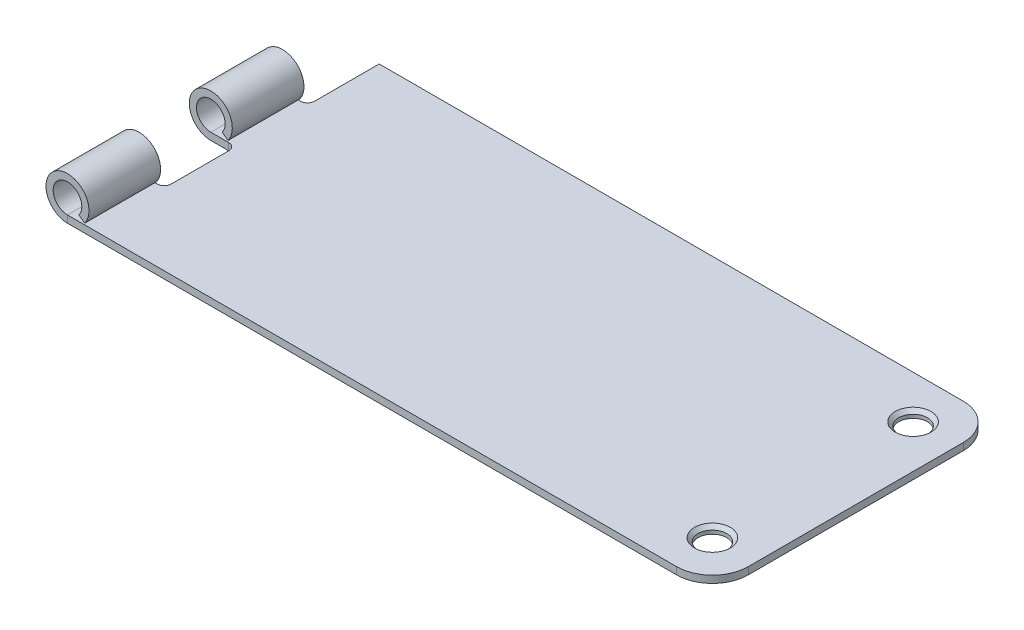
ISO-10303-21;
HEADER;
FILE_DESCRIPTION(('STEP AP214'),'2;1');
FILE_NAME('part.step','',(''),(''),'','','');
FILE_SCHEMA(('AUTOMOTIVE_DESIGN { 1 0 10303 214 1 1 1 1 }'));
ENDSEC;
DATA;
#1=APPLICATION_CONTEXT('core data for automotive mechanical design processes');
#2=APPLICATION_PROTOCOL_DEFINITION('international standard','automotive_design',2000,#1);
#3=PRODUCT_CONTEXT('',#1,'mechanical');
#4=PRODUCT('Part','Part','',(#3));
#5=PRODUCT_RELATED_PRODUCT_CATEGORY('part','',(#4));
#6=PRODUCT_DEFINITION_FORMATION('','',#4);
#7=PRODUCT_DEFINITION_CONTEXT('part definition',#1,'design');
#8=PRODUCT_DEFINITION('design','',#6,#7);
#9=PRODUCT_DEFINITION_SHAPE('','',#8);
#10=(LENGTH_UNIT() NAMED_UNIT(*) SI_UNIT(.MILLI.,.METRE.));
#11=(NAMED_UNIT(*) PLANE_ANGLE_UNIT() SI_UNIT($,.RADIAN.));
#12=(NAMED_UNIT(*) SI_UNIT($,.STERADIAN.) SOLID_ANGLE_UNIT());
#13=UNCERTAINTY_MEASURE_WITH_UNIT(LENGTH_MEASURE(1.E-05),#10,'distance_accuracy_value','');
#14=(GEOMETRIC_REPRESENTATION_CONTEXT(3) GLOBAL_UNCERTAINTY_ASSIGNED_CONTEXT((#13)) GLOBAL_UNIT_ASSIGNED_CONTEXT((#10,
#11,#12)) REPRESENTATION_CONTEXT('',''));
#15=CARTESIAN_POINT('',(0.,0.,0.));
#16=DIRECTION('',(0.,0.,1.));
#17=DIRECTION('',(1.,0.,0.));
#18=AXIS2_PLACEMENT_3D('',#15,#16,#17);
#19=CARTESIAN_POINT('',(-3.,3.,10.));
#20=DIRECTION('',(0.,0.,1.));
#21=DIRECTION('',(-1.,0.,0.));
#22=AXIS2_PLACEMENT_3D('',#19,#20,#21);
#23=PLANE('',#22);
#24=DIRECTION('',(1.,0.,0.));
#25=VECTOR('',#24,1.);
#26=CARTESIAN_POINT('',(-3.,-3.,10.));
#27=LINE('',#26,#25);
#28=CARTESIAN_POINT('',(0.,-3.,10.));
#29=VERTEX_POINT('',#28);
#30=CARTESIAN_POINT('',(2.5,-3.,10.));
#31=VERTEX_POINT('',#30);
#32=EDGE_CURVE('E217',#29,#31,#27,.T.);
#33=ORIENTED_EDGE('',*,*,#32,.F.);
#34=DIRECTION('',(0.,-1.,0.));
#35=VECTOR('',#34,1.);
#36=CARTESIAN_POINT('',(0.,-2.,10.));
#37=LINE('',#36,#35);
#38=CARTESIAN_POINT('',(0.,-2.,10.));
#39=VERTEX_POINT('',#38);
#40=EDGE_CURVE('E206',#39,#29,#37,.T.);
#41=ORIENTED_EDGE('',*,*,#40,.F.);
#42=DIRECTION('',(-1.,0.,0.));
#43=VECTOR('',#42,1.);
#44=CARTESIAN_POINT('',(0.,-2.,10.));
#45=LINE('',#44,#43);
#46=CARTESIAN_POINT('',(2.5,-2.,10.));
#47=VERTEX_POINT('',#46);
#48=EDGE_CURVE('E240',#47,#39,#45,.T.);
#49=ORIENTED_EDGE('',*,*,#48,.F.);
#50=DIRECTION('',(0.,-1.,0.));
#51=VECTOR('',#50,1.);
#52=CARTESIAN_POINT('',(2.5,-2.,10.));
#53=LINE('',#52,#51);
#54=EDGE_CURVE('E304',#31,#47,#53,.F.);
#55=ORIENTED_EDGE('',*,*,#54,.F.);
#56=EDGE_LOOP('',(#33,#41,#49,#55));
#57=FACE_BOUND('',#56,.T.);
#58=ADVANCED_FACE('F39',(#57),#23,.F.);
#59=CARTESIAN_POINT('',(-3.,3.,-10.));
#60=DIRECTION('',(0.,0.,1.));
#61=DIRECTION('',(-1.,0.,0.));
#62=AXIS2_PLACEMENT_3D('',#59,#60,#61);
#63=PLANE('',#62);
#64=DIRECTION('',(1.,0.,0.));
#65=VECTOR('',#64,1.);
#66=CARTESIAN_POINT('',(-3.,-3.,-10.));
#67=LINE('',#66,#65);
#68=CARTESIAN_POINT('',(0.,-3.,-10.));
#69=VERTEX_POINT('',#68);
#70=CARTESIAN_POINT('',(2.5,-3.,-10.));
#71=VERTEX_POINT('',#70);
#72=EDGE_CURVE('E178',#69,#71,#67,.T.);
#73=ORIENTED_EDGE('',*,*,#72,.F.);
#74=DIRECTION('',(0.,-1.,0.));
#75=VECTOR('',#74,1.);
#76=CARTESIAN_POINT('',(0.,-2.,-10.));
#77=LINE('',#76,#75);
#78=CARTESIAN_POINT('',(0.,-2.,-10.));
#79=VERTEX_POINT('',#78);
#80=EDGE_CURVE('E199',#79,#69,#77,.T.);
#81=ORIENTED_EDGE('',*,*,#80,.F.);
#82=DIRECTION('',(-1.,0.,0.));
#83=VECTOR('',#82,1.);
#84=CARTESIAN_POINT('',(0.,-2.,-10.));
#85=LINE('',#84,#83);
#86=CARTESIAN_POINT('',(2.5,-2.,-10.));
#87=VERTEX_POINT('',#86);
#88=EDGE_CURVE('E231',#87,#79,#85,.T.);
#89=ORIENTED_EDGE('',*,*,#88,.F.);
#90=DIRECTION('',(0.,-1.,0.));
#91=VECTOR('',#90,1.);
#92=CARTESIAN_POINT('',(2.5,-2.,-10.));
#93=LINE('',#92,#91);
#94=EDGE_CURVE('E212',#71,#87,#93,.F.);
#95=ORIENTED_EDGE('',*,*,#94,.F.);
#96=EDGE_LOOP('',(#73,#81,#89,#95));
#97=FACE_BOUND('',#96,.T.);
#98=ADVANCED_FACE('F210',(#97),#63,.F.);
#99=CARTESIAN_POINT('',(0.,0.,-20.));
#100=DIRECTION('',(0.,0.,1.));
#101=DIRECTION('',(-1.,0.,0.));
#102=AXIS2_PLACEMENT_3D('',#99,#100,#101);
#103=CYLINDRICAL_SURFACE('',#102,2.);
#104=CARTESIAN_POINT('',(0.,0.,0.));
#105=DIRECTION('',(0.,0.,1.));
#106=DIRECTION('',(1.,0.,0.));
#107=AXIS2_PLACEMENT_3D('',#104,#105,#106);
#108=CIRCLE('',#107,2.);
#109=CARTESIAN_POINT('',(1.6,-1.2,0.));
#110=VERTEX_POINT('',#109);
#111=CARTESIAN_POINT('',(0.,-2.,0.));
#112=VERTEX_POINT('',#111);
#113=EDGE_CURVE('E245',#110,#112,#108,.T.);
#114=ORIENTED_EDGE('',*,*,#113,.T.);
#115=DIRECTION('',(0.,0.,1.));
#116=VECTOR('',#115,1.);
#117=CARTESIAN_POINT('',(0.,-2.,-20.));
#118=LINE('',#117,#116);
#119=EDGE_CURVE('E277',#79,#112,#118,.T.);
#120=ORIENTED_EDGE('',*,*,#119,.F.);
#121=CARTESIAN_POINT('',(0.,0.,-10.));
#122=DIRECTION('',(0.,0.,-1.));
#123=DIRECTION('',(-1.,0.,0.));
#124=AXIS2_PLACEMENT_3D('',#121,#122,#123);
#125=CIRCLE('',#124,2.);
#126=CARTESIAN_POINT('',(1.6,-1.2,-10.));
#127=VERTEX_POINT('',#126);
#128=EDGE_CURVE('E202',#79,#127,#125,.T.);
#129=ORIENTED_EDGE('',*,*,#128,.T.);
#130=DIRECTION('',(0.,0.,1.));
#131=VECTOR('',#130,1.);
#132=CARTESIAN_POINT('',(1.6,-1.2,-20.));
#133=LINE('',#132,#131);
#134=EDGE_CURVE('E273',#127,#110,#133,.T.);
#135=ORIENTED_EDGE('',*,*,#134,.T.);
#136=EDGE_LOOP('',(#114,#120,#129,#135));
#137=FACE_BOUND('',#136,.T.);
#138=ADVANCED_FACE('F377',(#137),#103,.F.);
#139=CARTESIAN_POINT('',(2.4,-1.8,-20.));
#140=DIRECTION('',(-0.6,-0.8,0.));
#141=DIRECTION('',(0.8,-0.6,0.));
#142=AXIS2_PLACEMENT_3D('',#139,#140,#141);
#143=PLANE('',#142);
#144=DIRECTION('',(-0.8,0.6,0.));
#145=VECTOR('',#144,1.);
#146=CARTESIAN_POINT('',(2.4,-1.8,0.));
#147=LINE('',#146,#145);
#148=CARTESIAN_POINT('',(2.4,-1.8,0.));
#149=VERTEX_POINT('',#148);
#150=EDGE_CURVE('E243',#149,#110,#147,.T.);
#151=ORIENTED_EDGE('',*,*,#150,.T.);
#152=ORIENTED_EDGE('',*,*,#134,.F.);
#153=DIRECTION('',(0.8,-0.6,0.));
#154=VECTOR('',#153,1.);
#155=CARTESIAN_POINT('',(2.4,-1.8,-10.));
#156=LINE('',#155,#154);
#157=CARTESIAN_POINT('',(2.4,-1.8,-10.));
#158=VERTEX_POINT('',#157);
#159=EDGE_CURVE('E228',#127,#158,#156,.T.);
#160=ORIENTED_EDGE('',*,*,#159,.T.);
#161=DIRECTION('',(0.,0.,1.));
#162=VECTOR('',#161,1.);
#163=CARTESIAN_POINT('',(2.4,-1.8,-20.));
#164=LINE('',#163,#162);
#165=EDGE_CURVE('E192',#158,#149,#164,.T.);
#166=ORIENTED_EDGE('',*,*,#165,.T.);
#167=EDGE_LOOP('',(#151,#152,#160,#166));
#168=FACE_BOUND('',#167,.T.);
#169=ADVANCED_FACE('F469',(#168),#143,.T.);
#170=CARTESIAN_POINT('',(0.,0.,-20.));
#171=DIRECTION('',(0.,0.,1.));
#172=DIRECTION('',(-1.,0.,0.));
#173=AXIS2_PLACEMENT_3D('',#170,#171,#172);
#174=CYLINDRICAL_SURFACE('',#173,3.);
#175=ORIENTED_EDGE('',*,*,#165,.F.);
#176=CARTESIAN_POINT('',(0.,0.,-10.));
#177=DIRECTION('',(0.,0.,-1.));
#178=DIRECTION('',(-1.,0.,0.));
#179=AXIS2_PLACEMENT_3D('',#176,#177,#178);
#180=CIRCLE('',#179,3.);
#181=EDGE_CURVE('E188',#69,#158,#180,.T.);
#182=ORIENTED_EDGE('',*,*,#181,.F.);
#183=DIRECTION('',(0.,0.,1.));
#184=VECTOR('',#183,1.);
#185=CARTESIAN_POINT('',(0.,-3.,-20.));
#186=LINE('',#185,#184);
#187=CARTESIAN_POINT('',(0.,-3.,0.));
#188=VERTEX_POINT('',#187);
#189=EDGE_CURVE('E172',#69,#188,#186,.T.);
#190=ORIENTED_EDGE('',*,*,#189,.T.);
#191=CARTESIAN_POINT('',(0.,0.,0.));
#192=DIRECTION('',(0.,0.,1.));
#193=DIRECTION('',(1.,0.,0.));
#194=AXIS2_PLACEMENT_3D('',#191,#192,#193);
#195=CIRCLE('',#194,3.);
#196=EDGE_CURVE('E289',#149,#188,#195,.T.);
#197=ORIENTED_EDGE('',*,*,#196,.F.);
#198=EDGE_LOOP('',(#175,#182,#190,#197));
#199=FACE_BOUND('',#198,.T.);
#200=ADVANCED_FACE('F190',(#199),#174,.T.);
#201=CARTESIAN_POINT('',(0.,-3.,20.));
#202=DIRECTION('',(0.,0.,1.));
#203=DIRECTION('',(-1.,0.,0.));
#204=AXIS2_PLACEMENT_3D('',#201,#202,#203);
#205=PLANE('',#204);
#206=DIRECTION('',(0.,1.,0.));
#207=VECTOR('',#206,1.);
#208=CARTESIAN_POINT('',(0.,-3.,20.));
#209=LINE('',#208,#207);
#210=CARTESIAN_POINT('',(0.,-3.,20.));
#211=VERTEX_POINT('',#210);
#212=CARTESIAN_POINT('',(0.,-2.,20.));
#213=VERTEX_POINT('',#212);
#214=EDGE_CURVE('E284',#211,#213,#209,.T.);
#215=ORIENTED_EDGE('',*,*,#214,.T.);
#216=CARTESIAN_POINT('',(0.,0.,20.));
#217=DIRECTION('',(0.,0.,1.));
#218=DIRECTION('',(1.,0.,0.));
#219=AXIS2_PLACEMENT_3D('',#216,#217,#218);
#220=CIRCLE('',#219,2.);
#221=CARTESIAN_POINT('',(1.6,-1.2,20.));
#222=VERTEX_POINT('',#221);
#223=EDGE_CURVE('E262',#222,#213,#220,.T.);
#224=ORIENTED_EDGE('',*,*,#223,.F.);
#225=DIRECTION('',(-0.8,0.6,0.));
#226=VECTOR('',#225,1.);
#227=CARTESIAN_POINT('',(2.4,-1.8,20.));
#228=LINE('',#227,#226);
#229=CARTESIAN_POINT('',(2.4,-1.8,20.));
#230=VERTEX_POINT('',#229);
#231=EDGE_CURVE('E265',#230,#222,#228,.T.);
#232=ORIENTED_EDGE('',*,*,#231,.F.);
#233=CARTESIAN_POINT('',(0.,0.,20.));
#234=DIRECTION('',(0.,0.,1.));
#235=DIRECTION('',(1.,0.,0.));
#236=AXIS2_PLACEMENT_3D('',#233,#234,#235);
#237=CIRCLE('',#236,3.);
#238=EDGE_CURVE('E256',#230,#211,#237,.T.);
#239=ORIENTED_EDGE('',*,*,#238,.T.);
#240=EDGE_LOOP('',(#215,#224,#232,#239));
#241=FACE_BOUND('',#240,.T.);
#242=ADVANCED_FACE('F406',(#241),#205,.T.);
#243=CARTESIAN_POINT('',(0.,-3.,-20.));
#244=DIRECTION('',(0.,1.,0.));
#245=DIRECTION('',(0.,0.,-1.));
#246=AXIS2_PLACEMENT_3D('',#243,#244,#245);
#247=PLANE('',#246);
#248=CARTESIAN_POINT('',(84.,-3.,14.));
#249=DIRECTION('',(0.,-1.,0.));
#250=DIRECTION('',(0.,0.,-1.));
#251=AXIS2_PLACEMENT_3D('',#248,#249,#250);
#252=CIRCLE('',#251,2.00000000000001);
#253=CARTESIAN_POINT('',(84.,-3.,12.));
#254=VERTEX_POINT('',#253);
#255=EDGE_CURVE('E214',#254,#254,#252,.F.);
#256=ORIENTED_EDGE('',*,*,#255,.T.);
#257=EDGE_LOOP('',(#256));
#258=FACE_BOUND('',#257,.T.);
#259=CARTESIAN_POINT('',(84.,-3.,-14.));
#260=DIRECTION('',(0.,-1.,0.));
#261=DIRECTION('',(0.,0.,-1.));
#262=AXIS2_PLACEMENT_3D('',#259,#260,#261);
#263=CIRCLE('',#262,2.00000000000001);
#264=CARTESIAN_POINT('',(84.,-3.,-16.));
#265=VERTEX_POINT('',#264);
#266=EDGE_CURVE('E220',#265,#265,#263,.F.);
#267=ORIENTED_EDGE('',*,*,#266,.T.);
#268=EDGE_LOOP('',(#267));
#269=FACE_BOUND('',#268,.T.);
#270=DIRECTION('',(1.,0.,0.));
#271=VECTOR('',#270,1.);
#272=CARTESIAN_POINT('',(0.,-3.,20.));
#273=LINE('',#272,#271);
#274=CARTESIAN_POINT('',(85.,-3.,20.));
#275=VERTEX_POINT('',#274);
#276=EDGE_CURVE('E251',#211,#275,#273,.T.);
#277=ORIENTED_EDGE('',*,*,#276,.F.);
#278=EDGE_CURVE('E185',#29,#211,#186,.T.);
#279=ORIENTED_EDGE('',*,*,#278,.F.);
#280=ORIENTED_EDGE('',*,*,#32,.T.);
#281=CARTESIAN_POINT('',(2.5,-3.,9.));
#282=DIRECTION('',(0.,-1.,0.));
#283=DIRECTION('',(0.,0.,-1.));
#284=AXIS2_PLACEMENT_3D('',#281,#282,#283);
#285=CIRCLE('',#284,1.);
#286=CARTESIAN_POINT('',(3.5,-3.,9.));
#287=VERTEX_POINT('',#286);
#288=EDGE_CURVE('E318',#287,#31,#285,.T.);
#289=ORIENTED_EDGE('',*,*,#288,.F.);
#290=DIRECTION('',(0.,0.,-1.));
#291=VECTOR('',#290,1.);
#292=CARTESIAN_POINT('',(3.5,-3.,10.));
#293=LINE('',#292,#291);
#294=CARTESIAN_POINT('',(3.5,-3.,0.999999999999999));
#295=VERTEX_POINT('',#294);
#296=EDGE_CURVE('E389',#287,#295,#293,.T.);
#297=ORIENTED_EDGE('',*,*,#296,.T.);
#298=CARTESIAN_POINT('',(2.5,-3.,1.));
#299=DIRECTION('',(0.,-1.,0.));
#300=DIRECTION('',(0.,0.,-1.));
#301=AXIS2_PLACEMENT_3D('',#298,#299,#300);
#302=CIRCLE('',#301,1.);
#303=CARTESIAN_POINT('',(2.5,-3.,0.));
#304=VERTEX_POINT('',#303);
#305=EDGE_CURVE('E312',#304,#295,#302,.T.);
#306=ORIENTED_EDGE('',*,*,#305,.F.);
#307=DIRECTION('',(-1.,0.,0.));
#308=VECTOR('',#307,1.);
#309=CARTESIAN_POINT('',(-3.,-3.,0.));
#310=LINE('',#309,#308);
#311=EDGE_CURVE('E181',#304,#188,#310,.T.);
#312=ORIENTED_EDGE('',*,*,#311,.T.);
#313=ORIENTED_EDGE('',*,*,#189,.F.);
#314=ORIENTED_EDGE('',*,*,#72,.T.);
#315=CARTESIAN_POINT('',(2.5,-3.,-11.));
#316=DIRECTION('',(0.,-1.,0.));
#317=DIRECTION('',(0.,0.,-1.));
#318=AXIS2_PLACEMENT_3D('',#315,#316,#317);
#319=CIRCLE('',#318,1.);
#320=CARTESIAN_POINT('',(3.5,-3.,-11.));
#321=VERTEX_POINT('',#320);
#322=EDGE_CURVE('E307',#321,#71,#319,.T.);
#323=ORIENTED_EDGE('',*,*,#322,.F.);
#324=DIRECTION('',(0.,0.,-1.));
#325=VECTOR('',#324,1.);
#326=CARTESIAN_POINT('',(3.5,-3.,-20.));
#327=LINE('',#326,#325);
#328=CARTESIAN_POINT('',(3.5,-3.,-20.));
#329=VERTEX_POINT('',#328);
#330=EDGE_CURVE('E213',#321,#329,#327,.T.);
#331=ORIENTED_EDGE('',*,*,#330,.T.);
#332=DIRECTION('',(1.,0.,0.));
#333=VECTOR('',#332,1.);
#334=CARTESIAN_POINT('',(0.,-3.,-20.));
#335=LINE('',#334,#333);
#336=CARTESIAN_POINT('',(85.,-3.,-20.));
#337=VERTEX_POINT('',#336);
#338=EDGE_CURVE('E252',#329,#337,#335,.T.);
#339=ORIENTED_EDGE('',*,*,#338,.T.);
#340=CARTESIAN_POINT('',(85.,-3.,-15.));
#341=DIRECTION('',(0.,-1.,0.));
#342=DIRECTION('',(0.,0.,-1.));
#343=AXIS2_PLACEMENT_3D('',#340,#341,#342);
#344=CIRCLE('',#343,5.);
#345=CARTESIAN_POINT('',(90.,-3.,-15.));
#346=VERTEX_POINT('',#345);
#347=EDGE_CURVE('E325',#346,#337,#344,.F.);
#348=ORIENTED_EDGE('',*,*,#347,.F.);
#349=DIRECTION('',(0.,0.,1.));
#350=VECTOR('',#349,1.);
#351=CARTESIAN_POINT('',(90.,-3.,-20.));
#352=LINE('',#351,#350);
#353=CARTESIAN_POINT('',(90.,-3.,15.));
#354=VERTEX_POINT('',#353);
#355=EDGE_CURVE('E281',#346,#354,#352,.T.);
#356=ORIENTED_EDGE('',*,*,#355,.T.);
#357=CARTESIAN_POINT('',(85.,-3.,15.));
#358=DIRECTION('',(0.,-1.,0.));
#359=DIRECTION('',(0.,0.,-1.));
#360=AXIS2_PLACEMENT_3D('',#357,#358,#359);
#361=CIRCLE('',#360,5.);
#362=EDGE_CURVE('E327',#275,#354,#361,.F.);
#363=ORIENTED_EDGE('',*,*,#362,.F.);
#364=EDGE_LOOP('',(#277,#279,#280,#289,#297,#306,#312,#313,#314,#323,#331,#339,#348,#356,#363));
#365=FACE_BOUND('',#364,.T.);
#366=ADVANCED_FACE('F175',(#258,#269,#365),#247,.F.);
#367=CARTESIAN_POINT('',(90.,-2.,-20.));
#368=DIRECTION('',(1.,0.,0.));
#369=DIRECTION('',(0.,0.,1.));
#370=AXIS2_PLACEMENT_3D('',#367,#368,#369);
#371=PLANE('',#370);
#372=ORIENTED_EDGE('',*,*,#355,.F.);
#373=DIRECTION('',(0.,-1.,0.));
#374=VECTOR('',#373,1.);
#375=CARTESIAN_POINT('',(90.,-2.,-15.));
#376=LINE('',#375,#374);
#377=CARTESIAN_POINT('',(90.,-2.,-15.));
#378=VERTEX_POINT('',#377);
#379=EDGE_CURVE('E330',#378,#346,#376,.T.);
#380=ORIENTED_EDGE('',*,*,#379,.F.);
#381=DIRECTION('',(0.,0.,1.));
#382=VECTOR('',#381,1.);
#383=CARTESIAN_POINT('',(90.,-2.,-20.));
#384=LINE('',#383,#382);
#385=CARTESIAN_POINT('',(90.,-2.,15.));
#386=VERTEX_POINT('',#385);
#387=EDGE_CURVE('E278',#378,#386,#384,.T.);
#388=ORIENTED_EDGE('',*,*,#387,.T.);
#389=DIRECTION('',(0.,-1.,0.));
#390=VECTOR('',#389,1.);
#391=CARTESIAN_POINT('',(90.,-2.,15.));
#392=LINE('',#391,#390);
#393=EDGE_CURVE('E332',#354,#386,#392,.F.);
#394=ORIENTED_EDGE('',*,*,#393,.F.);
#395=EDGE_LOOP('',(#372,#380,#388,#394));
#396=FACE_BOUND('',#395,.T.);
#397=ADVANCED_FACE('F353',(#396),#371,.T.);
#398=CARTESIAN_POINT('',(0.,-2.,-20.));
#399=DIRECTION('',(0.,1.,0.));
#400=DIRECTION('',(0.,0.,-1.));
#401=AXIS2_PLACEMENT_3D('',#398,#399,#400);
#402=PLANE('',#401);
#403=CARTESIAN_POINT('',(84.,-2.,-14.));
#404=DIRECTION('',(0.,-1.,0.));
#405=DIRECTION('',(0.,0.,-1.));
#406=AXIS2_PLACEMENT_3D('',#403,#404,#405);
#407=CIRCLE('',#406,2.50000000000002);
#408=CARTESIAN_POINT('',(84.,-2.,-16.5));
#409=VERTEX_POINT('',#408);
#410=EDGE_CURVE('E47',#409,#409,#407,.F.);
#411=ORIENTED_EDGE('',*,*,#410,.F.);
#412=EDGE_LOOP('',(#411));
#413=FACE_BOUND('',#412,.T.);
#414=CARTESIAN_POINT('',(84.,-2.,14.));
#415=DIRECTION('',(0.,-1.,0.));
#416=DIRECTION('',(0.,0.,-1.));
#417=AXIS2_PLACEMENT_3D('',#414,#415,#416);
#418=CIRCLE('',#417,2.50000000000001);
#419=CARTESIAN_POINT('',(84.,-2.,11.5));
#420=VERTEX_POINT('',#419);
#421=EDGE_CURVE('E341',#420,#420,#418,.F.);
#422=ORIENTED_EDGE('',*,*,#421,.F.);
#423=EDGE_LOOP('',(#422));
#424=FACE_BOUND('',#423,.T.);
#425=ORIENTED_EDGE('',*,*,#387,.F.);
#426=CARTESIAN_POINT('',(85.,-2.,-15.));
#427=DIRECTION('',(0.,-1.,0.));
#428=DIRECTION('',(0.,0.,-1.));
#429=AXIS2_PLACEMENT_3D('',#426,#427,#428);
#430=CIRCLE('',#429,5.);
#431=CARTESIAN_POINT('',(85.,-2.,-20.));
#432=VERTEX_POINT('',#431);
#433=EDGE_CURVE('E334',#432,#378,#430,.T.);
#434=ORIENTED_EDGE('',*,*,#433,.F.);
#435=DIRECTION('',(1.,0.,0.));
#436=VECTOR('',#435,1.);
#437=CARTESIAN_POINT('',(0.,-2.,-20.));
#438=LINE('',#437,#436);
#439=CARTESIAN_POINT('',(3.5,-2.,-20.));
#440=VERTEX_POINT('',#439);
#441=EDGE_CURVE('E255',#440,#432,#438,.T.);
#442=ORIENTED_EDGE('',*,*,#441,.F.);
#443=DIRECTION('',(0.,0.,1.));
#444=VECTOR('',#443,1.);
#445=CARTESIAN_POINT('',(3.5,-2.,-20.));
#446=LINE('',#445,#444);
#447=CARTESIAN_POINT('',(3.5,-2.,-11.));
#448=VERTEX_POINT('',#447);
#449=EDGE_CURVE('E225',#440,#448,#446,.T.);
#450=ORIENTED_EDGE('',*,*,#449,.T.);
#451=CARTESIAN_POINT('',(2.5,-2.,-11.));
#452=DIRECTION('',(0.,-1.,0.));
#453=DIRECTION('',(0.,0.,-1.));
#454=AXIS2_PLACEMENT_3D('',#451,#452,#453);
#455=CIRCLE('',#454,1.);
#456=EDGE_CURVE('E309',#87,#448,#455,.F.);
#457=ORIENTED_EDGE('',*,*,#456,.F.);
#458=ORIENTED_EDGE('',*,*,#88,.T.);
#459=ORIENTED_EDGE('',*,*,#119,.T.);
#460=DIRECTION('',(1.,0.,0.));
#461=VECTOR('',#460,1.);
#462=CARTESIAN_POINT('',(0.,-2.,0.));
#463=LINE('',#462,#461);
#464=CARTESIAN_POINT('',(2.5,-2.,0.));
#465=VERTEX_POINT('',#464);
#466=EDGE_CURVE('E248',#112,#465,#463,.T.);
#467=ORIENTED_EDGE('',*,*,#466,.T.);
#468=CARTESIAN_POINT('',(2.5,-2.,1.));
#469=DIRECTION('',(0.,-1.,0.));
#470=DIRECTION('',(0.,0.,-1.));
#471=AXIS2_PLACEMENT_3D('',#468,#469,#470);
#472=CIRCLE('',#471,1.);
#473=CARTESIAN_POINT('',(3.5,-2.,1.));
#474=VERTEX_POINT('',#473);
#475=EDGE_CURVE('E315',#474,#465,#472,.F.);
#476=ORIENTED_EDGE('',*,*,#475,.F.);
#477=DIRECTION('',(0.,0.,1.));
#478=VECTOR('',#477,1.);
#479=CARTESIAN_POINT('',(3.5,-2.,-20.));
#480=LINE('',#479,#478);
#481=CARTESIAN_POINT('',(3.5,-2.,9.));
#482=VERTEX_POINT('',#481);
#483=EDGE_CURVE('E207',#474,#482,#480,.T.);
#484=ORIENTED_EDGE('',*,*,#483,.T.);
#485=CARTESIAN_POINT('',(2.5,-2.,9.));
#486=DIRECTION('',(0.,-1.,0.));
#487=DIRECTION('',(0.,0.,-1.));
#488=AXIS2_PLACEMENT_3D('',#485,#486,#487);
#489=CIRCLE('',#488,1.);
#490=EDGE_CURVE('E320',#47,#482,#489,.F.);
#491=ORIENTED_EDGE('',*,*,#490,.F.);
#492=ORIENTED_EDGE('',*,*,#48,.T.);
#493=EDGE_CURVE('E274',#39,#213,#118,.T.);
#494=ORIENTED_EDGE('',*,*,#493,.T.);
#495=DIRECTION('',(1.,0.,0.));
#496=VECTOR('',#495,1.);
#497=CARTESIAN_POINT('',(0.,-2.,20.));
#498=LINE('',#497,#496);
#499=CARTESIAN_POINT('',(85.,-2.,20.));
#500=VERTEX_POINT('',#499);
#501=EDGE_CURVE('E260',#213,#500,#498,.T.);
#502=ORIENTED_EDGE('',*,*,#501,.T.);
#503=CARTESIAN_POINT('',(85.,-2.,15.));
#504=DIRECTION('',(0.,-1.,0.));
#505=DIRECTION('',(0.,0.,-1.));
#506=AXIS2_PLACEMENT_3D('',#503,#504,#505);
#507=CIRCLE('',#506,5.);
#508=EDGE_CURVE('E62',#386,#500,#507,.T.);
#509=ORIENTED_EDGE('',*,*,#508,.F.);
#510=EDGE_LOOP('',(#425,#434,#442,#450,#457,#458,#459,#467,#476,#484,#491,#492,#494,#502,#509));
#511=FACE_BOUND('',#510,.T.);
#512=ADVANCED_FACE('F349',(#413,#424,#511),#402,.T.);
#513=CARTESIAN_POINT('',(0.,0.,10.));
#514=DIRECTION('',(0.,0.,-1.));
#515=DIRECTION('',(-1.,0.,0.));
#516=AXIS2_PLACEMENT_3D('',#513,#514,#515);
#517=CIRCLE('',#516,2.);
#518=CARTESIAN_POINT('',(1.6,-1.2,10.));
#519=VERTEX_POINT('',#518);
#520=EDGE_CURVE('E237',#39,#519,#517,.T.);
#521=ORIENTED_EDGE('',*,*,#520,.T.);
#522=EDGE_CURVE('E271',#519,#222,#133,.T.);
#523=ORIENTED_EDGE('',*,*,#522,.T.);
#524=ORIENTED_EDGE('',*,*,#223,.T.);
#525=ORIENTED_EDGE('',*,*,#493,.F.);
#526=EDGE_LOOP('',(#521,#523,#524,#525));
#527=FACE_BOUND('',#526,.T.);
#528=ADVANCED_FACE('F352',(#527),#103,.F.);
#529=DIRECTION('',(0.8,-0.6,0.));
#530=VECTOR('',#529,1.);
#531=CARTESIAN_POINT('',(2.39999999999999,-1.8,10.));
#532=LINE('',#531,#530);
#533=CARTESIAN_POINT('',(2.4,-1.8,10.));
#534=VERTEX_POINT('',#533);
#535=EDGE_CURVE('E234',#519,#534,#532,.T.);
#536=ORIENTED_EDGE('',*,*,#535,.T.);
#537=EDGE_CURVE('E184',#534,#230,#164,.T.);
#538=ORIENTED_EDGE('',*,*,#537,.T.);
#539=ORIENTED_EDGE('',*,*,#231,.T.);
#540=ORIENTED_EDGE('',*,*,#522,.F.);
#541=EDGE_LOOP('',(#536,#538,#539,#540));
#542=FACE_BOUND('',#541,.T.);
#543=ADVANCED_FACE('F465',(#542),#143,.T.);
#544=ORIENTED_EDGE('',*,*,#278,.T.);
#545=ORIENTED_EDGE('',*,*,#238,.F.);
#546=ORIENTED_EDGE('',*,*,#537,.F.);
#547=CARTESIAN_POINT('',(0.,0.,10.));
#548=DIRECTION('',(0.,0.,-1.));
#549=DIRECTION('',(-1.,0.,0.));
#550=AXIS2_PLACEMENT_3D('',#547,#548,#549);
#551=CIRCLE('',#550,3.);
#552=EDGE_CURVE('E195',#29,#534,#551,.T.);
#553=ORIENTED_EDGE('',*,*,#552,.F.);
#554=EDGE_LOOP('',(#544,#545,#546,#553));
#555=FACE_BOUND('',#554,.T.);
#556=ADVANCED_FACE('F460',(#555),#174,.T.);
#557=CARTESIAN_POINT('',(0.,0.,-20.));
#558=DIRECTION('',(0.,0.,-1.));
#559=DIRECTION('',(1.,0.,0.));
#560=AXIS2_PLACEMENT_3D('',#557,#558,#559);
#561=PLANE('',#560);
#562=ORIENTED_EDGE('',*,*,#338,.F.);
#563=DIRECTION('',(0.,1.,0.));
#564=VECTOR('',#563,1.);
#565=CARTESIAN_POINT('',(3.5,0.,-20.));
#566=LINE('',#565,#564);
#567=EDGE_CURVE('E196',#329,#440,#566,.T.);
#568=ORIENTED_EDGE('',*,*,#567,.T.);
#569=ORIENTED_EDGE('',*,*,#441,.T.);
#570=DIRECTION('',(0.,-1.,0.));
#571=VECTOR('',#570,1.);
#572=CARTESIAN_POINT('',(85.,0.,-20.));
#573=LINE('',#572,#571);
#574=EDGE_CURVE('E54',#337,#432,#573,.F.);
#575=ORIENTED_EDGE('',*,*,#574,.F.);
#576=EDGE_LOOP('',(#562,#568,#569,#575));
#577=FACE_BOUND('',#576,.T.);
#578=ADVANCED_FACE('F366',(#577),#561,.T.);
#579=CARTESIAN_POINT('',(0.,0.,20.));
#580=DIRECTION('',(0.,0.,-1.));
#581=DIRECTION('',(1.,0.,0.));
#582=AXIS2_PLACEMENT_3D('',#579,#580,#581);
#583=PLANE('',#582);
#584=ORIENTED_EDGE('',*,*,#501,.F.);
#585=ORIENTED_EDGE('',*,*,#214,.F.);
#586=ORIENTED_EDGE('',*,*,#276,.T.);
#587=DIRECTION('',(0.,-1.,0.));
#588=VECTOR('',#587,1.);
#589=CARTESIAN_POINT('',(85.,-3.,20.));
#590=LINE('',#589,#588);
#591=EDGE_CURVE('E323',#500,#275,#590,.T.);
#592=ORIENTED_EDGE('',*,*,#591,.F.);
#593=EDGE_LOOP('',(#584,#585,#586,#592));
#594=FACE_BOUND('',#593,.T.);
#595=ADVANCED_FACE('F409',(#594),#583,.F.);
#596=ORIENTED_EDGE('',*,*,#80,.T.);
#597=ORIENTED_EDGE('',*,*,#181,.T.);
#598=ORIENTED_EDGE('',*,*,#159,.F.);
#599=ORIENTED_EDGE('',*,*,#128,.F.);
#600=EDGE_LOOP('',(#596,#597,#598,#599));
#601=FACE_BOUND('',#600,.T.);
#602=ADVANCED_FACE('F200',(#601),#63,.F.);
#603=CARTESIAN_POINT('',(3.5,3.,-20.));
#604=DIRECTION('',(1.,0.,0.));
#605=DIRECTION('',(0.,0.,1.));
#606=AXIS2_PLACEMENT_3D('',#603,#604,#605);
#607=PLANE('',#606);
#608=ORIENTED_EDGE('',*,*,#449,.F.);
#609=ORIENTED_EDGE('',*,*,#567,.F.);
#610=ORIENTED_EDGE('',*,*,#330,.F.);
#611=DIRECTION('',(0.,-1.,0.));
#612=VECTOR('',#611,1.);
#613=CARTESIAN_POINT('',(3.5,-3.,-11.));
#614=LINE('',#613,#612);
#615=EDGE_CURVE('E295',#448,#321,#614,.T.);
#616=ORIENTED_EDGE('',*,*,#615,.F.);
#617=EDGE_LOOP('',(#608,#609,#610,#616));
#618=FACE_BOUND('',#617,.T.);
#619=ADVANCED_FACE('F369',(#618),#607,.F.);
#620=CARTESIAN_POINT('',(-3.,3.,0.));
#621=DIRECTION('',(0.,0.,-1.));
#622=DIRECTION('',(1.,0.,0.));
#623=AXIS2_PLACEMENT_3D('',#620,#621,#622);
#624=PLANE('',#623);
#625=ORIENTED_EDGE('',*,*,#466,.F.);
#626=ORIENTED_EDGE('',*,*,#113,.F.);
#627=ORIENTED_EDGE('',*,*,#150,.F.);
#628=ORIENTED_EDGE('',*,*,#196,.T.);
#629=ORIENTED_EDGE('',*,*,#311,.F.);
#630=DIRECTION('',(0.,-1.,0.));
#631=VECTOR('',#630,1.);
#632=CARTESIAN_POINT('',(2.5,-3.,0.));
#633=LINE('',#632,#631);
#634=EDGE_CURVE('E298',#465,#304,#633,.T.);
#635=ORIENTED_EDGE('',*,*,#634,.F.);
#636=EDGE_LOOP('',(#625,#626,#627,#628,#629,#635));
#637=FACE_BOUND('',#636,.T.);
#638=ADVANCED_FACE('F381',(#637),#624,.F.);
#639=ORIENTED_EDGE('',*,*,#40,.T.);
#640=ORIENTED_EDGE('',*,*,#552,.T.);
#641=ORIENTED_EDGE('',*,*,#535,.F.);
#642=ORIENTED_EDGE('',*,*,#520,.F.);
#643=EDGE_LOOP('',(#639,#640,#641,#642));
#644=FACE_BOUND('',#643,.T.);
#645=ADVANCED_FACE('F416',(#644),#23,.F.);
#646=CARTESIAN_POINT('',(3.5,3.,10.));
#647=DIRECTION('',(1.,0.,0.));
#648=DIRECTION('',(0.,0.,1.));
#649=AXIS2_PLACEMENT_3D('',#646,#647,#648);
#650=PLANE('',#649);
#651=ORIENTED_EDGE('',*,*,#296,.F.);
#652=DIRECTION('',(0.,-1.,0.));
#653=VECTOR('',#652,1.);
#654=CARTESIAN_POINT('',(3.5,-3.,9.));
#655=LINE('',#654,#653);
#656=EDGE_CURVE('E300',#482,#287,#655,.T.);
#657=ORIENTED_EDGE('',*,*,#656,.F.);
#658=ORIENTED_EDGE('',*,*,#483,.F.);
#659=DIRECTION('',(0.,-1.,0.));
#660=VECTOR('',#659,1.);
#661=CARTESIAN_POINT('',(3.5,-2.,1.));
#662=LINE('',#661,#660);
#663=EDGE_CURVE('E302',#295,#474,#662,.F.);
#664=ORIENTED_EDGE('',*,*,#663,.F.);
#665=EDGE_LOOP('',(#651,#657,#658,#664));
#666=FACE_BOUND('',#665,.T.);
#667=ADVANCED_FACE('F387',(#666),#650,.F.);
#668=CARTESIAN_POINT('',(2.5,3.,-11.));
#669=DIRECTION('',(0.,1.,0.));
#670=DIRECTION('',(0.,0.,-1.));
#671=AXIS2_PLACEMENT_3D('',#668,#669,#670);
#672=CYLINDRICAL_SURFACE('',#671,1.);
#673=ORIENTED_EDGE('',*,*,#456,.T.);
#674=ORIENTED_EDGE('',*,*,#615,.T.);
#675=ORIENTED_EDGE('',*,*,#322,.T.);
#676=ORIENTED_EDGE('',*,*,#94,.T.);
#677=EDGE_LOOP('',(#673,#674,#675,#676));
#678=FACE_BOUND('',#677,.T.);
#679=ADVANCED_FACE('F371',(#678),#672,.F.);
#680=CARTESIAN_POINT('',(2.5,3.,1.));
#681=DIRECTION('',(0.,1.,0.));
#682=DIRECTION('',(0.,0.,-1.));
#683=AXIS2_PLACEMENT_3D('',#680,#681,#682);
#684=CYLINDRICAL_SURFACE('',#683,1.);
#685=ORIENTED_EDGE('',*,*,#475,.T.);
#686=ORIENTED_EDGE('',*,*,#634,.T.);
#687=ORIENTED_EDGE('',*,*,#305,.T.);
#688=ORIENTED_EDGE('',*,*,#663,.T.);
#689=EDGE_LOOP('',(#685,#686,#687,#688));
#690=FACE_BOUND('',#689,.T.);
#691=ADVANCED_FACE('F383',(#690),#684,.F.);
#692=CARTESIAN_POINT('',(2.5,3.,9.));
#693=DIRECTION('',(0.,1.,0.));
#694=DIRECTION('',(0.,0.,-1.));
#695=AXIS2_PLACEMENT_3D('',#692,#693,#694);
#696=CYLINDRICAL_SURFACE('',#695,1.);
#697=ORIENTED_EDGE('',*,*,#490,.T.);
#698=ORIENTED_EDGE('',*,*,#656,.T.);
#699=ORIENTED_EDGE('',*,*,#288,.T.);
#700=ORIENTED_EDGE('',*,*,#54,.T.);
#701=EDGE_LOOP('',(#697,#698,#699,#700));
#702=FACE_BOUND('',#701,.T.);
#703=ADVANCED_FACE('F392',(#702),#696,.F.);
#704=CARTESIAN_POINT('',(85.,0.,15.));
#705=DIRECTION('',(0.,1.,0.));
#706=DIRECTION('',(0.,0.,-1.));
#707=AXIS2_PLACEMENT_3D('',#704,#705,#706);
#708=CYLINDRICAL_SURFACE('',#707,5.);
#709=ORIENTED_EDGE('',*,*,#508,.T.);
#710=ORIENTED_EDGE('',*,*,#591,.T.);
#711=ORIENTED_EDGE('',*,*,#362,.T.);
#712=ORIENTED_EDGE('',*,*,#393,.T.);
#713=EDGE_LOOP('',(#709,#710,#711,#712));
#714=FACE_BOUND('',#713,.T.);
#715=ADVANCED_FACE('F412',(#714),#708,.T.);
#716=CARTESIAN_POINT('',(85.,-2.,-15.));
#717=DIRECTION('',(0.,-1.,0.));
#718=DIRECTION('',(0.,0.,1.));
#719=AXIS2_PLACEMENT_3D('',#716,#717,#718);
#720=CYLINDRICAL_SURFACE('',#719,5.);
#721=ORIENTED_EDGE('',*,*,#433,.T.);
#722=ORIENTED_EDGE('',*,*,#379,.T.);
#723=ORIENTED_EDGE('',*,*,#347,.T.);
#724=ORIENTED_EDGE('',*,*,#574,.T.);
#725=EDGE_LOOP('',(#721,#722,#723,#724));
#726=FACE_BOUND('',#725,.T.);
#727=ADVANCED_FACE('F362',(#726),#720,.T.);
#728=CARTESIAN_POINT('',(84.,-3.001,-14.));
#729=DIRECTION('',(0.,1.,0.));
#730=DIRECTION('',(0.,0.,-1.));
#731=AXIS2_PLACEMENT_3D('',#728,#729,#730);
#732=CYLINDRICAL_SURFACE('',#731,2.00000000000001);
#733=CARTESIAN_POINT('',(84.,-2.5,-14.));
#734=DIRECTION('',(0.,-1.,0.));
#735=DIRECTION('',(0.,0.,-1.));
#736=AXIS2_PLACEMENT_3D('',#733,#734,#735);
#737=CIRCLE('',#736,2.00000000000001);
#738=CARTESIAN_POINT('',(84.,-2.5,-16.));
#739=VERTEX_POINT('',#738);
#740=EDGE_CURVE('E338',#739,#739,#737,.T.);
#741=ORIENTED_EDGE('',*,*,#740,.F.);
#742=EDGE_LOOP('',(#741));
#743=FACE_BOUND('',#742,.T.);
#744=ORIENTED_EDGE('',*,*,#266,.F.);
#745=EDGE_LOOP('',(#744));
#746=FACE_BOUND('',#745,.T.);
#747=ADVANCED_FACE('F424',(#743,#746),#732,.F.);
#748=CARTESIAN_POINT('',(84.,-3.001,14.));
#749=DIRECTION('',(0.,1.,0.));
#750=DIRECTION('',(0.,0.,-1.));
#751=AXIS2_PLACEMENT_3D('',#748,#749,#750);
#752=CYLINDRICAL_SURFACE('',#751,2.00000000000001);
#753=CARTESIAN_POINT('',(84.,-2.5,14.));
#754=DIRECTION('',(0.,-1.,0.));
#755=DIRECTION('',(0.,0.,-1.));
#756=AXIS2_PLACEMENT_3D('',#753,#754,#755);
#757=CIRCLE('',#756,2.00000000000001);
#758=CARTESIAN_POINT('',(84.,-2.5,12.));
#759=VERTEX_POINT('',#758);
#760=EDGE_CURVE('E11',#759,#759,#757,.T.);
#761=ORIENTED_EDGE('',*,*,#760,.F.);
#762=EDGE_LOOP('',(#761));
#763=FACE_BOUND('',#762,.T.);
#764=ORIENTED_EDGE('',*,*,#255,.F.);
#765=EDGE_LOOP('',(#764));
#766=FACE_BOUND('',#765,.T.);
#767=ADVANCED_FACE('F426',(#763,#766),#752,.F.);
#768=CARTESIAN_POINT('',(84.,-2.5,-14.));
#769=DIRECTION('',(0.,1.,0.));
#770=DIRECTION('',(0.,0.,-1.));
#771=AXIS2_PLACEMENT_3D('',#768,#769,#770);
#772=CONICAL_SURFACE('',#771,2.00000000000001,0.785398163397455);
#773=ORIENTED_EDGE('',*,*,#410,.T.);
#774=EDGE_LOOP('',(#773));
#775=FACE_BOUND('',#774,.T.);
#776=ORIENTED_EDGE('',*,*,#740,.T.);
#777=EDGE_LOOP('',(#776));
#778=FACE_BOUND('',#777,.T.);
#779=ADVANCED_FACE('F346',(#775,#778),#772,.F.);
#780=CARTESIAN_POINT('',(84.,-2.5,14.));
#781=DIRECTION('',(0.,1.,0.));
#782=DIRECTION('',(0.,0.,-1.));
#783=AXIS2_PLACEMENT_3D('',#780,#781,#782);
#784=CONICAL_SURFACE('',#783,2.00000000000001,0.785398163397453);
#785=ORIENTED_EDGE('',*,*,#421,.T.);
#786=EDGE_LOOP('',(#785));
#787=FACE_BOUND('',#786,.T.);
#788=ORIENTED_EDGE('',*,*,#760,.T.);
#789=EDGE_LOOP('',(#788));
#790=FACE_BOUND('',#789,.T.);
#791=ADVANCED_FACE('F41',(#787,#790),#784,.F.);
#792=CLOSED_SHELL('',(#58,#98,#138,#169,#200,#242,#366,#397,#512,#528,#543,#556,#578,#595,#602,
#619,#638,#645,#667,#679,#691,#703,#715,#727,#747,#767,#779,#791));
#793=MANIFOLD_SOLID_BREP('B2',#792);
#794=ADVANCED_BREP_SHAPE_REPRESENTATION('',(#18,#793),#14);
#795=SHAPE_DEFINITION_REPRESENTATION(#9,#794);
ENDSEC;
END-ISO-10303-21;
